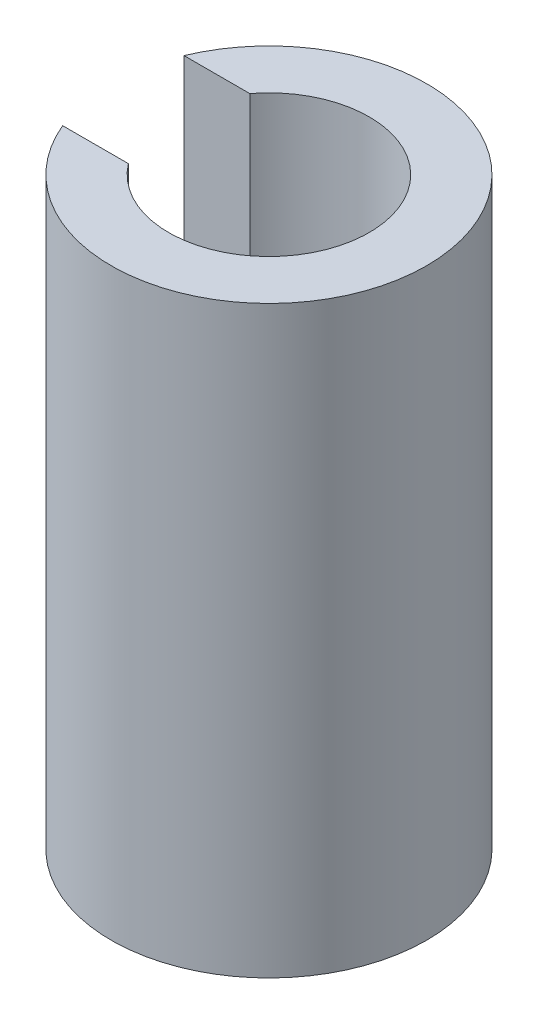
ISO-10303-21;
HEADER;
FILE_DESCRIPTION(('STEP AP214'),'2;1');
FILE_NAME('part.step','',(''),(''),'','','');
FILE_SCHEMA(('AUTOMOTIVE_DESIGN { 1 0 10303 214 1 1 1 1 }'));
ENDSEC;
DATA;
#1=APPLICATION_CONTEXT('core data for automotive mechanical design processes');
#2=APPLICATION_PROTOCOL_DEFINITION('international standard','automotive_design',2000,#1);
#3=PRODUCT_CONTEXT('',#1,'mechanical');
#4=PRODUCT('Part','Part','',(#3));
#5=PRODUCT_RELATED_PRODUCT_CATEGORY('part','',(#4));
#6=PRODUCT_DEFINITION_FORMATION('','',#4);
#7=PRODUCT_DEFINITION_CONTEXT('part definition',#1,'design');
#8=PRODUCT_DEFINITION('design','',#6,#7);
#9=PRODUCT_DEFINITION_SHAPE('','',#8);
#10=(LENGTH_UNIT() NAMED_UNIT(*) SI_UNIT(.MILLI.,.METRE.));
#11=(NAMED_UNIT(*) PLANE_ANGLE_UNIT() SI_UNIT($,.RADIAN.));
#12=(NAMED_UNIT(*) SI_UNIT($,.STERADIAN.) SOLID_ANGLE_UNIT());
#13=UNCERTAINTY_MEASURE_WITH_UNIT(LENGTH_MEASURE(1.E-05),#10,'distance_accuracy_value','');
#14=(GEOMETRIC_REPRESENTATION_CONTEXT(3) GLOBAL_UNCERTAINTY_ASSIGNED_CONTEXT((#13)) GLOBAL_UNIT_ASSIGNED_CONTEXT((#10,
#11,#12)) REPRESENTATION_CONTEXT('',''));
#15=CARTESIAN_POINT('',(0.,0.,0.));
#16=DIRECTION('',(0.,0.,1.));
#17=DIRECTION('',(1.,0.,0.));
#18=AXIS2_PLACEMENT_3D('',#15,#16,#17);
#19=CARTESIAN_POINT('',(0.,1.,0.));
#20=DIRECTION('',(0.,-1.,0.));
#21=DIRECTION('',(0.,0.,-1.));
#22=AXIS2_PLACEMENT_3D('',#19,#20,#21);
#23=CYLINDRICAL_SURFACE('',#22,1.25);
#24=CARTESIAN_POINT('',(0.,0.,0.));
#25=DIRECTION('',(0.,-1.,0.));
#26=DIRECTION('',(0.,0.,-1.));
#27=AXIS2_PLACEMENT_3D('',#24,#25,#26);
#28=CIRCLE('',#27,1.25);
#29=CARTESIAN_POINT('',(1.14564392373896,0.,0.5));
#30=VERTEX_POINT('',#29);
#31=CARTESIAN_POINT('',(1.14564392373896,0.,-0.5));
#32=VERTEX_POINT('',#31);
#33=EDGE_CURVE('E113',#30,#32,#28,.T.);
#34=ORIENTED_EDGE('',*,*,#33,.F.);
#35=DIRECTION('',(0.,-1.,0.));
#36=VECTOR('',#35,1.);
#37=CARTESIAN_POINT('',(1.14564392373896,1.,0.5));
#38=LINE('',#37,#36);
#39=CARTESIAN_POINT('',(1.14564392373896,1.,0.5));
#40=VERTEX_POINT('',#39);
#41=EDGE_CURVE('E12',#40,#30,#38,.T.);
#42=ORIENTED_EDGE('',*,*,#41,.F.);
#43=CARTESIAN_POINT('',(0.,1.,0.));
#44=DIRECTION('',(0.,-1.,0.));
#45=DIRECTION('',(0.,0.,-1.));
#46=AXIS2_PLACEMENT_3D('',#43,#44,#45);
#47=CIRCLE('',#46,1.25);
#48=CARTESIAN_POINT('',(1.14564392373896,1.,-0.5));
#49=VERTEX_POINT('',#48);
#50=EDGE_CURVE('E107',#40,#49,#47,.T.);
#51=ORIENTED_EDGE('',*,*,#50,.T.);
#52=DIRECTION('',(0.,-1.,0.));
#53=VECTOR('',#52,1.);
#54=CARTESIAN_POINT('',(1.14564392373896,1.,-0.5));
#55=LINE('',#54,#53);
#56=EDGE_CURVE('E52',#49,#32,#55,.T.);
#57=ORIENTED_EDGE('',*,*,#56,.T.);
#58=EDGE_LOOP('',(#34,#42,#51,#57));
#59=FACE_BOUND('',#58,.T.);
#60=ADVANCED_FACE('F49',(#59),#23,.T.);
#61=CARTESIAN_POINT('',(1.14564392373896,1.,0.5));
#62=DIRECTION('',(0.,0.,1.));
#63=DIRECTION('',(1.,0.,0.));
#64=AXIS2_PLACEMENT_3D('',#61,#62,#63);
#65=PLANE('',#64);
#66=DIRECTION('',(-1.,0.,0.));
#67=VECTOR('',#66,1.);
#68=CARTESIAN_POINT('',(1.14564392373896,0.,0.5));
#69=LINE('',#68,#67);
#70=CARTESIAN_POINT('',(2.52598990496795,0.,0.5));
#71=VERTEX_POINT('',#70);
#72=EDGE_CURVE('E109',#71,#30,#69,.T.);
#73=ORIENTED_EDGE('',*,*,#72,.F.);
#74=DIRECTION('',(0.,-1.,0.));
#75=VECTOR('',#74,1.);
#76=CARTESIAN_POINT('',(2.52598990496795,1.,0.5));
#77=LINE('',#76,#75);
#78=CARTESIAN_POINT('',(2.52598990496795,1.,0.5));
#79=VERTEX_POINT('',#78);
#80=EDGE_CURVE('E58',#79,#71,#77,.T.);
#81=ORIENTED_EDGE('',*,*,#80,.F.);
#82=DIRECTION('',(-1.,0.,0.));
#83=VECTOR('',#82,1.);
#84=CARTESIAN_POINT('',(1.14564392373896,1.,0.5));
#85=LINE('',#84,#83);
#86=EDGE_CURVE('E104',#79,#40,#85,.T.);
#87=ORIENTED_EDGE('',*,*,#86,.T.);
#88=ORIENTED_EDGE('',*,*,#41,.T.);
#89=EDGE_LOOP('',(#73,#81,#87,#88));
#90=FACE_BOUND('',#89,.T.);
#91=ADVANCED_FACE('F123',(#90),#65,.T.);
#92=CARTESIAN_POINT('',(0.,1.,0.));
#93=DIRECTION('',(0.,-1.,0.));
#94=DIRECTION('',(0.,0.,-1.));
#95=AXIS2_PLACEMENT_3D('',#92,#93,#94);
#96=CYLINDRICAL_SURFACE('',#95,2.575);
#97=CARTESIAN_POINT('',(0.,0.,0.));
#98=DIRECTION('',(0.,-1.,0.));
#99=DIRECTION('',(0.,0.,-1.));
#100=AXIS2_PLACEMENT_3D('',#97,#98,#99);
#101=CIRCLE('',#100,2.575);
#102=CARTESIAN_POINT('',(2.52598990496795,0.,-0.5));
#103=VERTEX_POINT('',#102);
#104=EDGE_CURVE('E99',#103,#71,#101,.T.);
#105=ORIENTED_EDGE('',*,*,#104,.F.);
#106=DIRECTION('',(0.,-1.,0.));
#107=VECTOR('',#106,1.);
#108=CARTESIAN_POINT('',(2.52598990496795,1.,-0.5));
#109=LINE('',#108,#107);
#110=CARTESIAN_POINT('',(2.52598990496795,1.,-0.5));
#111=VERTEX_POINT('',#110);
#112=EDGE_CURVE('E94',#111,#103,#109,.T.);
#113=ORIENTED_EDGE('',*,*,#112,.F.);
#114=CARTESIAN_POINT('',(0.,1.,0.));
#115=DIRECTION('',(0.,-1.,0.));
#116=DIRECTION('',(0.,0.,-1.));
#117=AXIS2_PLACEMENT_3D('',#114,#115,#116);
#118=CIRCLE('',#117,2.575);
#119=EDGE_CURVE('E97',#111,#79,#118,.T.);
#120=ORIENTED_EDGE('',*,*,#119,.T.);
#121=ORIENTED_EDGE('',*,*,#80,.T.);
#122=EDGE_LOOP('',(#105,#113,#120,#121));
#123=FACE_BOUND('',#122,.T.);
#124=ADVANCED_FACE('F96',(#123),#96,.T.);
#125=CARTESIAN_POINT('',(1.14564392373896,1.,-0.5));
#126=DIRECTION('',(0.,0.,-1.));
#127=DIRECTION('',(-1.,0.,0.));
#128=AXIS2_PLACEMENT_3D('',#125,#126,#127);
#129=PLANE('',#128);
#130=DIRECTION('',(1.,0.,0.));
#131=VECTOR('',#130,1.);
#132=CARTESIAN_POINT('',(1.14564392373896,0.,-0.5));
#133=LINE('',#132,#131);
#134=EDGE_CURVE('E116',#32,#103,#133,.T.);
#135=ORIENTED_EDGE('',*,*,#134,.F.);
#136=ORIENTED_EDGE('',*,*,#56,.F.);
#137=DIRECTION('',(1.,0.,0.));
#138=VECTOR('',#137,1.);
#139=CARTESIAN_POINT('',(1.14564392373896,1.,-0.5));
#140=LINE('',#139,#138);
#141=EDGE_CURVE('E103',#49,#111,#140,.T.);
#142=ORIENTED_EDGE('',*,*,#141,.T.);
#143=ORIENTED_EDGE('',*,*,#112,.T.);
#144=EDGE_LOOP('',(#135,#136,#142,#143));
#145=FACE_BOUND('',#144,.T.);
#146=ADVANCED_FACE('F106',(#145),#129,.T.);
#147=CARTESIAN_POINT('',(0.,1.,0.));
#148=DIRECTION('',(0.,-1.,0.));
#149=DIRECTION('',(0.,0.,-1.));
#150=AXIS2_PLACEMENT_3D('',#147,#148,#149);
#151=PLANE('',#150);
#152=ORIENTED_EDGE('',*,*,#50,.F.);
#153=ORIENTED_EDGE('',*,*,#86,.F.);
#154=ORIENTED_EDGE('',*,*,#119,.F.);
#155=ORIENTED_EDGE('',*,*,#141,.F.);
#156=EDGE_LOOP('',(#152,#153,#154,#155));
#157=FACE_BOUND('',#156,.T.);
#158=ADVANCED_FACE('F102',(#157),#151,.F.);
#159=CARTESIAN_POINT('',(0.,0.,0.));
#160=DIRECTION('',(0.,-1.,0.));
#161=DIRECTION('',(0.,0.,-1.));
#162=AXIS2_PLACEMENT_3D('',#159,#160,#161);
#163=PLANE('',#162);
#164=ORIENTED_EDGE('',*,*,#33,.T.);
#165=ORIENTED_EDGE('',*,*,#134,.T.);
#166=ORIENTED_EDGE('',*,*,#104,.T.);
#167=ORIENTED_EDGE('',*,*,#72,.T.);
#168=EDGE_LOOP('',(#164,#165,#166,#167));
#169=FACE_BOUND('',#168,.T.);
#170=ADVANCED_FACE('F122',(#169),#163,.T.);
#171=CLOSED_SHELL('',(#60,#91,#124,#146,#158,#170));
#172=MANIFOLD_SOLID_BREP('B2',#171);
#173=CARTESIAN_POINT('',(0.,15.,0.));
#174=DIRECTION('',(0.,1.,0.));
#175=DIRECTION('',(0.,0.,1.));
#176=AXIS2_PLACEMENT_3D('',#173,#174,#175);
#177=PLANE('',#176);
#178=DIRECTION('',(-1.,0.,0.));
#179=VECTOR('',#178,1.);
#180=CARTESIAN_POINT('',(-4.05,15.,-1.55824420422474));
#181=LINE('',#180,#179);
#182=CARTESIAN_POINT('',(-2.05,15.,-1.55824420422474));
#183=VERTEX_POINT('',#182);
#184=CARTESIAN_POINT('',(-3.73823153376031,15.,-1.55824420422474));
#185=VERTEX_POINT('',#184);
#186=EDGE_CURVE('E231',#183,#185,#181,.T.);
#187=ORIENTED_EDGE('',*,*,#186,.F.);
#188=CARTESIAN_POINT('',(0.,15.,0.));
#189=DIRECTION('',(0.,1.,0.));
#190=DIRECTION('',(0.,0.,1.));
#191=AXIS2_PLACEMENT_3D('',#188,#189,#190);
#192=CIRCLE('',#191,2.575);
#193=CARTESIAN_POINT('',(-2.05,15.,1.55824420422474));
#194=VERTEX_POINT('',#193);
#195=EDGE_CURVE('E235',#194,#183,#192,.T.);
#196=ORIENTED_EDGE('',*,*,#195,.F.);
#197=DIRECTION('',(1.,0.,0.));
#198=VECTOR('',#197,1.);
#199=CARTESIAN_POINT('',(-4.05,15.,1.55824420422474));
#200=LINE('',#199,#198);
#201=CARTESIAN_POINT('',(-3.73823153376031,15.,1.55824420422474));
#202=VERTEX_POINT('',#201);
#203=EDGE_CURVE('E197',#202,#194,#200,.T.);
#204=ORIENTED_EDGE('',*,*,#203,.F.);
#205=CARTESIAN_POINT('',(0.,15.,0.));
#206=DIRECTION('',(0.,1.,0.));
#207=DIRECTION('',(0.,0.,1.));
#208=AXIS2_PLACEMENT_3D('',#205,#206,#207);
#209=CIRCLE('',#208,4.05);
#210=EDGE_CURVE('E47',#202,#185,#209,.T.);
#211=ORIENTED_EDGE('',*,*,#210,.T.);
#212=EDGE_LOOP('',(#187,#196,#204,#211));
#213=FACE_BOUND('',#212,.T.);
#214=ADVANCED_FACE('F173',(#213),#177,.T.);
#215=CARTESIAN_POINT('',(0.,0.,0.));
#216=DIRECTION('',(0.,1.,0.));
#217=DIRECTION('',(0.,0.,1.));
#218=AXIS2_PLACEMENT_3D('',#215,#216,#217);
#219=PLANE('',#218);
#220=CARTESIAN_POINT('',(0.,0.,0.));
#221=DIRECTION('',(0.,1.,0.));
#222=DIRECTION('',(0.,0.,1.));
#223=AXIS2_PLACEMENT_3D('',#220,#221,#222);
#224=CIRCLE('',#223,2.575);
#225=CARTESIAN_POINT('',(-2.05,0.,1.55824420422474));
#226=VERTEX_POINT('',#225);
#227=CARTESIAN_POINT('',(-2.05,0.,-1.55824420422474));
#228=VERTEX_POINT('',#227);
#229=EDGE_CURVE('E228',#226,#228,#224,.T.);
#230=ORIENTED_EDGE('',*,*,#229,.T.);
#231=DIRECTION('',(-1.,0.,0.));
#232=VECTOR('',#231,1.);
#233=CARTESIAN_POINT('',(-4.05,0.,-1.55824420422474));
#234=LINE('',#233,#232);
#235=CARTESIAN_POINT('',(-3.73823153376031,0.,-1.55824420422474));
#236=VERTEX_POINT('',#235);
#237=EDGE_CURVE('E189',#228,#236,#234,.T.);
#238=ORIENTED_EDGE('',*,*,#237,.T.);
#239=CARTESIAN_POINT('',(0.,0.,0.));
#240=DIRECTION('',(0.,1.,0.));
#241=DIRECTION('',(0.,0.,1.));
#242=AXIS2_PLACEMENT_3D('',#239,#240,#241);
#243=CIRCLE('',#242,4.05);
#244=CARTESIAN_POINT('',(-3.73823153376031,0.,1.55824420422474));
#245=VERTEX_POINT('',#244);
#246=EDGE_CURVE('E177',#245,#236,#243,.T.);
#247=ORIENTED_EDGE('',*,*,#246,.F.);
#248=DIRECTION('',(1.,0.,0.));
#249=VECTOR('',#248,1.);
#250=CARTESIAN_POINT('',(-4.05,0.,1.55824420422474));
#251=LINE('',#250,#249);
#252=EDGE_CURVE('E215',#245,#226,#251,.T.);
#253=ORIENTED_EDGE('',*,*,#252,.T.);
#254=EDGE_LOOP('',(#230,#238,#247,#253));
#255=FACE_BOUND('',#254,.T.);
#256=ADVANCED_FACE('F227',(#255),#219,.F.);
#257=CARTESIAN_POINT('',(0.,15.,0.));
#258=DIRECTION('',(0.,-1.,0.));
#259=DIRECTION('',(0.,0.,-1.));
#260=AXIS2_PLACEMENT_3D('',#257,#258,#259);
#261=CYLINDRICAL_SURFACE('',#260,4.05);
#262=ORIENTED_EDGE('',*,*,#246,.T.);
#263=DIRECTION('',(0.,-1.,0.));
#264=VECTOR('',#263,1.);
#265=CARTESIAN_POINT('',(-3.73823153376031,15.,-1.55824420422474));
#266=LINE('',#265,#264);
#267=EDGE_CURVE('E236',#236,#185,#266,.F.);
#268=ORIENTED_EDGE('',*,*,#267,.T.);
#269=ORIENTED_EDGE('',*,*,#210,.F.);
#270=DIRECTION('',(0.,-1.,0.));
#271=VECTOR('',#270,1.);
#272=CARTESIAN_POINT('',(-3.73823153376031,15.,1.55824420422474));
#273=LINE('',#272,#271);
#274=EDGE_CURVE('E242',#202,#245,#273,.T.);
#275=ORIENTED_EDGE('',*,*,#274,.T.);
#276=EDGE_LOOP('',(#262,#268,#269,#275));
#277=FACE_BOUND('',#276,.T.);
#278=ADVANCED_FACE('F175',(#277),#261,.T.);
#279=CARTESIAN_POINT('',(0.,15.,0.));
#280=DIRECTION('',(0.,-1.,0.));
#281=DIRECTION('',(0.,0.,-1.));
#282=AXIS2_PLACEMENT_3D('',#279,#280,#281);
#283=CYLINDRICAL_SURFACE('',#282,2.575);
#284=DIRECTION('',(0.,1.,0.));
#285=VECTOR('',#284,1.);
#286=CARTESIAN_POINT('',(-2.05,0.,-1.55824420422474));
#287=LINE('',#286,#285);
#288=EDGE_CURVE('E222',#228,#183,#287,.T.);
#289=ORIENTED_EDGE('',*,*,#288,.F.);
#290=ORIENTED_EDGE('',*,*,#229,.F.);
#291=DIRECTION('',(0.,1.,0.));
#292=VECTOR('',#291,1.);
#293=CARTESIAN_POINT('',(-2.05,0.,1.55824420422474));
#294=LINE('',#293,#292);
#295=EDGE_CURVE('E212',#226,#194,#294,.T.);
#296=ORIENTED_EDGE('',*,*,#295,.T.);
#297=ORIENTED_EDGE('',*,*,#195,.T.);
#298=EDGE_LOOP('',(#289,#290,#296,#297));
#299=FACE_BOUND('',#298,.T.);
#300=ADVANCED_FACE('F233',(#299),#283,.F.);
#301=CARTESIAN_POINT('',(-4.05,0.,1.55824420422474));
#302=DIRECTION('',(0.,0.,1.));
#303=DIRECTION('',(1.,0.,0.));
#304=AXIS2_PLACEMENT_3D('',#301,#302,#303);
#305=PLANE('',#304);
#306=ORIENTED_EDGE('',*,*,#203,.T.);
#307=ORIENTED_EDGE('',*,*,#295,.F.);
#308=ORIENTED_EDGE('',*,*,#252,.F.);
#309=ORIENTED_EDGE('',*,*,#274,.F.);
#310=EDGE_LOOP('',(#306,#307,#308,#309));
#311=FACE_BOUND('',#310,.T.);
#312=ADVANCED_FACE('F214',(#311),#305,.F.);
#313=CARTESIAN_POINT('',(-4.05,0.,-1.55824420422474));
#314=DIRECTION('',(0.,0.,-1.));
#315=DIRECTION('',(-1.,0.,0.));
#316=AXIS2_PLACEMENT_3D('',#313,#314,#315);
#317=PLANE('',#316);
#318=ORIENTED_EDGE('',*,*,#237,.F.);
#319=ORIENTED_EDGE('',*,*,#288,.T.);
#320=ORIENTED_EDGE('',*,*,#186,.T.);
#321=ORIENTED_EDGE('',*,*,#267,.F.);
#322=EDGE_LOOP('',(#318,#319,#320,#321));
#323=FACE_BOUND('',#322,.T.);
#324=ADVANCED_FACE('F259',(#323),#317,.F.);
#325=CLOSED_SHELL('',(#214,#256,#278,#300,#312,#324));
#326=MANIFOLD_SOLID_BREP('B6',#325);
#327=ADVANCED_BREP_SHAPE_REPRESENTATION('',(#18,#172,#326),#14);
#328=SHAPE_DEFINITION_REPRESENTATION(#9,#327);
ENDSEC;
END-ISO-10303-21;
